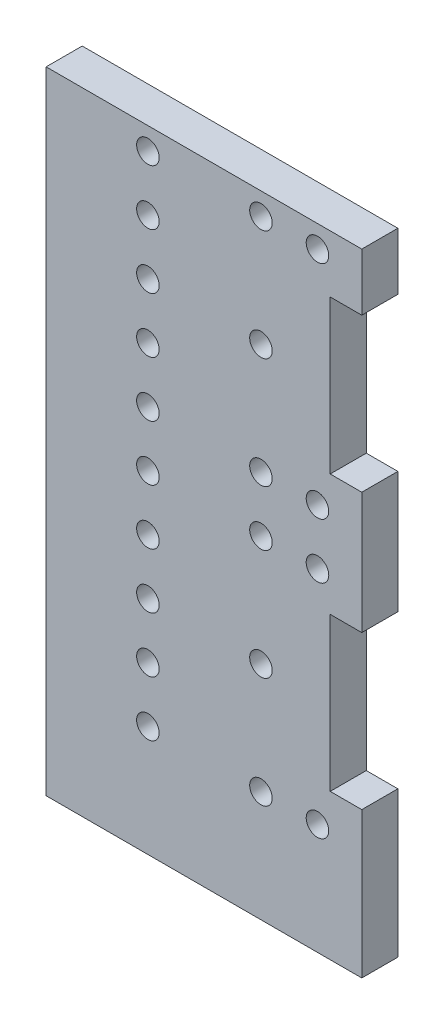
ISO-10303-21;
HEADER;
FILE_DESCRIPTION(('STEP AP214'),'2;1');
FILE_NAME('part.step','',(''),(''),'','','');
FILE_SCHEMA(('AUTOMOTIVE_DESIGN { 1 0 10303 214 1 1 1 1 }'));
ENDSEC;
DATA;
#1=APPLICATION_CONTEXT('core data for automotive mechanical design processes');
#2=APPLICATION_PROTOCOL_DEFINITION('international standard','automotive_design',2000,#1);
#3=PRODUCT_CONTEXT('',#1,'mechanical');
#4=PRODUCT('Part','Part','',(#3));
#5=PRODUCT_RELATED_PRODUCT_CATEGORY('part','',(#4));
#6=PRODUCT_DEFINITION_FORMATION('','',#4);
#7=PRODUCT_DEFINITION_CONTEXT('part definition',#1,'design');
#8=PRODUCT_DEFINITION('design','',#6,#7);
#9=PRODUCT_DEFINITION_SHAPE('','',#8);
#10=(LENGTH_UNIT() NAMED_UNIT(*) SI_UNIT(.MILLI.,.METRE.));
#11=(NAMED_UNIT(*) PLANE_ANGLE_UNIT() SI_UNIT($,.RADIAN.));
#12=(NAMED_UNIT(*) SI_UNIT($,.STERADIAN.) SOLID_ANGLE_UNIT());
#13=UNCERTAINTY_MEASURE_WITH_UNIT(LENGTH_MEASURE(1.E-05),#10,'distance_accuracy_value','');
#14=(GEOMETRIC_REPRESENTATION_CONTEXT(3) GLOBAL_UNCERTAINTY_ASSIGNED_CONTEXT((#13)) GLOBAL_UNIT_ASSIGNED_CONTEXT((#10,
#11,#12)) REPRESENTATION_CONTEXT('',''));
#15=CARTESIAN_POINT('',(0.,0.,0.));
#16=DIRECTION('',(0.,0.,1.));
#17=DIRECTION('',(1.,0.,0.));
#18=AXIS2_PLACEMENT_3D('',#15,#16,#17);
#19=CARTESIAN_POINT('',(7.,-7.532,1.6));
#20=DIRECTION('',(-1.,0.,0.));
#21=DIRECTION('',(0.,-1.,0.));
#22=AXIS2_PLACEMENT_3D('',#19,#20,#21);
#23=PLANE('',#22);
#24=DIRECTION('',(0.,1.,0.));
#25=VECTOR('',#24,1.);
#26=CARTESIAN_POINT('',(7.,-7.532,0.));
#27=LINE('',#26,#25);
#28=CARTESIAN_POINT('',(7.,-14.,0.));
#29=VERTEX_POINT('',#28);
#30=CARTESIAN_POINT('',(7.,-7.532,0.));
#31=VERTEX_POINT('',#30);
#32=EDGE_CURVE('E166',#29,#31,#27,.T.);
#33=ORIENTED_EDGE('',*,*,#32,.T.);
#34=DIRECTION('',(0.,0.,-1.));
#35=VECTOR('',#34,1.);
#36=CARTESIAN_POINT('',(7.,-7.532,1.6));
#37=LINE('',#36,#35);
#38=CARTESIAN_POINT('',(7.,-7.532,1.6));
#39=VERTEX_POINT('',#38);
#40=EDGE_CURVE('E11',#39,#31,#37,.T.);
#41=ORIENTED_EDGE('',*,*,#40,.F.);
#42=DIRECTION('',(0.,1.,0.));
#43=VECTOR('',#42,1.);
#44=CARTESIAN_POINT('',(7.,-7.532,1.6));
#45=LINE('',#44,#43);
#46=CARTESIAN_POINT('',(7.,-14.,1.6));
#47=VERTEX_POINT('',#46);
#48=EDGE_CURVE('E201',#47,#39,#45,.T.);
#49=ORIENTED_EDGE('',*,*,#48,.F.);
#50=DIRECTION('',(0.,0.,-1.));
#51=VECTOR('',#50,1.);
#52=CARTESIAN_POINT('',(7.,-14.,1.6));
#53=LINE('',#52,#51);
#54=EDGE_CURVE('E162',#47,#29,#53,.T.);
#55=ORIENTED_EDGE('',*,*,#54,.T.);
#56=EDGE_LOOP('',(#33,#41,#49,#55));
#57=FACE_BOUND('',#56,.T.);
#58=ADVANCED_FACE('F41',(#57),#23,.F.);
#59=CARTESIAN_POINT('',(5.6,-7.532,1.6));
#60=DIRECTION('',(0.,-1.,0.));
#61=DIRECTION('',(0.,0.,-1.));
#62=AXIS2_PLACEMENT_3D('',#59,#60,#61);
#63=PLANE('',#62);
#64=DIRECTION('',(-1.,0.,0.));
#65=VECTOR('',#64,1.);
#66=CARTESIAN_POINT('',(5.6,-7.532,0.));
#67=LINE('',#66,#65);
#68=CARTESIAN_POINT('',(5.6,-7.532,0.));
#69=VERTEX_POINT('',#68);
#70=EDGE_CURVE('E170',#31,#69,#67,.T.);
#71=ORIENTED_EDGE('',*,*,#70,.T.);
#72=DIRECTION('',(0.,0.,-1.));
#73=VECTOR('',#72,1.);
#74=CARTESIAN_POINT('',(5.6,-7.532,1.6));
#75=LINE('',#74,#73);
#76=CARTESIAN_POINT('',(5.6,-7.532,1.6));
#77=VERTEX_POINT('',#76);
#78=EDGE_CURVE('E50',#77,#69,#75,.T.);
#79=ORIENTED_EDGE('',*,*,#78,.F.);
#80=DIRECTION('',(-1.,0.,0.));
#81=VECTOR('',#80,1.);
#82=CARTESIAN_POINT('',(5.6,-7.532,1.6));
#83=LINE('',#82,#81);
#84=EDGE_CURVE('E113',#39,#77,#83,.T.);
#85=ORIENTED_EDGE('',*,*,#84,.F.);
#86=ORIENTED_EDGE('',*,*,#40,.T.);
#87=EDGE_LOOP('',(#71,#79,#85,#86));
#88=FACE_BOUND('',#87,.T.);
#89=ADVANCED_FACE('F296',(#88),#63,.F.);
#90=CARTESIAN_POINT('',(5.6,-0.732,1.6));
#91=DIRECTION('',(-1.,0.,0.));
#92=DIRECTION('',(0.,-1.,0.));
#93=AXIS2_PLACEMENT_3D('',#90,#91,#92);
#94=PLANE('',#93);
#95=DIRECTION('',(0.,1.,0.));
#96=VECTOR('',#95,1.);
#97=CARTESIAN_POINT('',(5.6,-0.732,0.));
#98=LINE('',#97,#96);
#99=CARTESIAN_POINT('',(5.6,-0.732,0.));
#100=VERTEX_POINT('',#99);
#101=EDGE_CURVE('E174',#69,#100,#98,.T.);
#102=ORIENTED_EDGE('',*,*,#101,.T.);
#103=DIRECTION('',(0.,0.,-1.));
#104=VECTOR('',#103,1.);
#105=CARTESIAN_POINT('',(5.6,-0.732,1.6));
#106=LINE('',#105,#104);
#107=CARTESIAN_POINT('',(5.6,-0.732,1.6));
#108=VERTEX_POINT('',#107);
#109=EDGE_CURVE('E228',#108,#100,#106,.T.);
#110=ORIENTED_EDGE('',*,*,#109,.F.);
#111=DIRECTION('',(0.,1.,0.));
#112=VECTOR('',#111,1.);
#113=CARTESIAN_POINT('',(5.6,-0.732,1.6));
#114=LINE('',#113,#112);
#115=EDGE_CURVE('E238',#77,#108,#114,.T.);
#116=ORIENTED_EDGE('',*,*,#115,.F.);
#117=ORIENTED_EDGE('',*,*,#78,.T.);
#118=EDGE_LOOP('',(#102,#110,#116,#117));
#119=FACE_BOUND('',#118,.T.);
#120=ADVANCED_FACE('F236',(#119),#94,.F.);
#121=CARTESIAN_POINT('',(7.,-0.732,1.6));
#122=DIRECTION('',(0.,1.,0.));
#123=DIRECTION('',(-1.,0.,0.));
#124=AXIS2_PLACEMENT_3D('',#121,#122,#123);
#125=PLANE('',#124);
#126=DIRECTION('',(1.,0.,0.));
#127=VECTOR('',#126,1.);
#128=CARTESIAN_POINT('',(7.,-0.732,0.));
#129=LINE('',#128,#127);
#130=CARTESIAN_POINT('',(7.,-0.732,0.));
#131=VERTEX_POINT('',#130);
#132=EDGE_CURVE('E177',#100,#131,#129,.T.);
#133=ORIENTED_EDGE('',*,*,#132,.T.);
#134=DIRECTION('',(0.,0.,-1.));
#135=VECTOR('',#134,1.);
#136=CARTESIAN_POINT('',(7.,-0.732,1.6));
#137=LINE('',#136,#135);
#138=CARTESIAN_POINT('',(7.,-0.732,1.6));
#139=VERTEX_POINT('',#138);
#140=EDGE_CURVE('E224',#139,#131,#137,.T.);
#141=ORIENTED_EDGE('',*,*,#140,.F.);
#142=DIRECTION('',(1.,0.,0.));
#143=VECTOR('',#142,1.);
#144=CARTESIAN_POINT('',(7.,-0.732,1.6));
#145=LINE('',#144,#143);
#146=EDGE_CURVE('E257',#108,#139,#145,.T.);
#147=ORIENTED_EDGE('',*,*,#146,.F.);
#148=ORIENTED_EDGE('',*,*,#109,.T.);
#149=EDGE_LOOP('',(#133,#141,#147,#148));
#150=FACE_BOUND('',#149,.T.);
#151=ADVANCED_FACE('F247',(#150),#125,.F.);
#152=CARTESIAN_POINT('',(7.,4.66,1.6));
#153=DIRECTION('',(-1.,0.,0.));
#154=DIRECTION('',(0.,-1.,0.));
#155=AXIS2_PLACEMENT_3D('',#152,#153,#154);
#156=PLANE('',#155);
#157=DIRECTION('',(0.,1.,0.));
#158=VECTOR('',#157,1.);
#159=CARTESIAN_POINT('',(7.,4.66,0.));
#160=LINE('',#159,#158);
#161=CARTESIAN_POINT('',(7.,4.66,0.));
#162=VERTEX_POINT('',#161);
#163=EDGE_CURVE('E180',#131,#162,#160,.T.);
#164=ORIENTED_EDGE('',*,*,#163,.T.);
#165=DIRECTION('',(0.,0.,-1.));
#166=VECTOR('',#165,1.);
#167=CARTESIAN_POINT('',(7.,4.66,1.6));
#168=LINE('',#167,#166);
#169=CARTESIAN_POINT('',(7.,4.66,1.6));
#170=VERTEX_POINT('',#169);
#171=EDGE_CURVE('E220',#170,#162,#168,.T.);
#172=ORIENTED_EDGE('',*,*,#171,.F.);
#173=DIRECTION('',(0.,1.,0.));
#174=VECTOR('',#173,1.);
#175=CARTESIAN_POINT('',(7.,4.66,1.6));
#176=LINE('',#175,#174);
#177=EDGE_CURVE('E253',#139,#170,#176,.T.);
#178=ORIENTED_EDGE('',*,*,#177,.F.);
#179=ORIENTED_EDGE('',*,*,#140,.T.);
#180=EDGE_LOOP('',(#164,#172,#178,#179));
#181=FACE_BOUND('',#180,.T.);
#182=ADVANCED_FACE('F251',(#181),#156,.F.);
#183=CARTESIAN_POINT('',(5.6,4.66,1.6));
#184=DIRECTION('',(0.,-1.,0.));
#185=DIRECTION('',(0.,0.,-1.));
#186=AXIS2_PLACEMENT_3D('',#183,#184,#185);
#187=PLANE('',#186);
#188=DIRECTION('',(-1.,0.,0.));
#189=VECTOR('',#188,1.);
#190=CARTESIAN_POINT('',(5.6,4.66,0.));
#191=LINE('',#190,#189);
#192=CARTESIAN_POINT('',(5.6,4.66,0.));
#193=VERTEX_POINT('',#192);
#194=EDGE_CURVE('E183',#162,#193,#191,.T.);
#195=ORIENTED_EDGE('',*,*,#194,.T.);
#196=DIRECTION('',(0.,0.,-1.));
#197=VECTOR('',#196,1.);
#198=CARTESIAN_POINT('',(5.6,4.66,1.6));
#199=LINE('',#198,#197);
#200=CARTESIAN_POINT('',(5.6,4.66,1.6));
#201=VERTEX_POINT('',#200);
#202=EDGE_CURVE('E216',#201,#193,#199,.T.);
#203=ORIENTED_EDGE('',*,*,#202,.F.);
#204=DIRECTION('',(-1.,0.,0.));
#205=VECTOR('',#204,1.);
#206=CARTESIAN_POINT('',(5.6,4.66,1.6));
#207=LINE('',#206,#205);
#208=EDGE_CURVE('E256',#170,#201,#207,.T.);
#209=ORIENTED_EDGE('',*,*,#208,.F.);
#210=ORIENTED_EDGE('',*,*,#171,.T.);
#211=EDGE_LOOP('',(#195,#203,#209,#210));
#212=FACE_BOUND('',#211,.T.);
#213=ADVANCED_FACE('F309',(#212),#187,.F.);
#214=CARTESIAN_POINT('',(5.6,11.46,1.6));
#215=DIRECTION('',(-1.,0.,0.));
#216=DIRECTION('',(0.,0.,1.));
#217=AXIS2_PLACEMENT_3D('',#214,#215,#216);
#218=PLANE('',#217);
#219=DIRECTION('',(0.,1.,0.));
#220=VECTOR('',#219,1.);
#221=CARTESIAN_POINT('',(5.6,11.46,0.));
#222=LINE('',#221,#220);
#223=CARTESIAN_POINT('',(5.6,11.46,0.));
#224=VERTEX_POINT('',#223);
#225=EDGE_CURVE('E186',#193,#224,#222,.T.);
#226=ORIENTED_EDGE('',*,*,#225,.T.);
#227=DIRECTION('',(0.,0.,-1.));
#228=VECTOR('',#227,1.);
#229=CARTESIAN_POINT('',(5.6,11.46,1.6));
#230=LINE('',#229,#228);
#231=CARTESIAN_POINT('',(5.6,11.46,1.6));
#232=VERTEX_POINT('',#231);
#233=EDGE_CURVE('E212',#232,#224,#230,.T.);
#234=ORIENTED_EDGE('',*,*,#233,.F.);
#235=DIRECTION('',(0.,1.,0.));
#236=VECTOR('',#235,1.);
#237=CARTESIAN_POINT('',(5.6,11.46,1.6));
#238=LINE('',#237,#236);
#239=EDGE_CURVE('E261',#201,#232,#238,.T.);
#240=ORIENTED_EDGE('',*,*,#239,.F.);
#241=ORIENTED_EDGE('',*,*,#202,.T.);
#242=EDGE_LOOP('',(#226,#234,#240,#241));
#243=FACE_BOUND('',#242,.T.);
#244=ADVANCED_FACE('F312',(#243),#218,.F.);
#245=CARTESIAN_POINT('',(7.,11.46,1.6));
#246=DIRECTION('',(0.,1.,0.));
#247=DIRECTION('',(0.,0.,1.));
#248=AXIS2_PLACEMENT_3D('',#245,#246,#247);
#249=PLANE('',#248);
#250=DIRECTION('',(1.,0.,0.));
#251=VECTOR('',#250,1.);
#252=CARTESIAN_POINT('',(7.,11.46,0.));
#253=LINE('',#252,#251);
#254=CARTESIAN_POINT('',(7.,11.46,0.));
#255=VERTEX_POINT('',#254);
#256=EDGE_CURVE('E189',#224,#255,#253,.T.);
#257=ORIENTED_EDGE('',*,*,#256,.T.);
#258=DIRECTION('',(0.,0.,-1.));
#259=VECTOR('',#258,1.);
#260=CARTESIAN_POINT('',(7.,11.46,1.6));
#261=LINE('',#260,#259);
#262=CARTESIAN_POINT('',(7.,11.46,1.6));
#263=VERTEX_POINT('',#262);
#264=EDGE_CURVE('E208',#263,#255,#261,.T.);
#265=ORIENTED_EDGE('',*,*,#264,.F.);
#266=DIRECTION('',(1.,0.,0.));
#267=VECTOR('',#266,1.);
#268=CARTESIAN_POINT('',(7.,11.46,1.6));
#269=LINE('',#268,#267);
#270=EDGE_CURVE('E268',#232,#263,#269,.T.);
#271=ORIENTED_EDGE('',*,*,#270,.F.);
#272=ORIENTED_EDGE('',*,*,#233,.T.);
#273=EDGE_LOOP('',(#257,#265,#271,#272));
#274=FACE_BOUND('',#273,.T.);
#275=ADVANCED_FACE('F276',(#274),#249,.F.);
#276=CARTESIAN_POINT('',(7.,14.,1.6));
#277=DIRECTION('',(-1.,0.,0.));
#278=DIRECTION('',(0.,0.,1.));
#279=AXIS2_PLACEMENT_3D('',#276,#277,#278);
#280=PLANE('',#279);
#281=DIRECTION('',(0.,1.,0.));
#282=VECTOR('',#281,1.);
#283=CARTESIAN_POINT('',(7.,14.,0.));
#284=LINE('',#283,#282);
#285=CARTESIAN_POINT('',(7.,14.,0.));
#286=VERTEX_POINT('',#285);
#287=EDGE_CURVE('E192',#255,#286,#284,.T.);
#288=ORIENTED_EDGE('',*,*,#287,.T.);
#289=DIRECTION('',(0.,0.,-1.));
#290=VECTOR('',#289,1.);
#291=CARTESIAN_POINT('',(7.,14.,1.6));
#292=LINE('',#291,#290);
#293=CARTESIAN_POINT('',(7.,14.,1.6));
#294=VERTEX_POINT('',#293);
#295=EDGE_CURVE('E155',#294,#286,#292,.T.);
#296=ORIENTED_EDGE('',*,*,#295,.F.);
#297=DIRECTION('',(0.,1.,0.));
#298=VECTOR('',#297,1.);
#299=CARTESIAN_POINT('',(7.,14.,1.6));
#300=LINE('',#299,#298);
#301=EDGE_CURVE('E144',#263,#294,#300,.T.);
#302=ORIENTED_EDGE('',*,*,#301,.F.);
#303=ORIENTED_EDGE('',*,*,#264,.T.);
#304=EDGE_LOOP('',(#288,#296,#302,#303));
#305=FACE_BOUND('',#304,.T.);
#306=ADVANCED_FACE('F280',(#305),#280,.F.);
#307=CARTESIAN_POINT('',(-7.,14.,1.6));
#308=DIRECTION('',(0.,-1.,0.));
#309=DIRECTION('',(0.,0.,-1.));
#310=AXIS2_PLACEMENT_3D('',#307,#308,#309);
#311=PLANE('',#310);
#312=DIRECTION('',(-1.,0.,0.));
#313=VECTOR('',#312,1.);
#314=CARTESIAN_POINT('',(-7.,14.,0.));
#315=LINE('',#314,#313);
#316=CARTESIAN_POINT('',(-7.,14.,0.));
#317=VERTEX_POINT('',#316);
#318=EDGE_CURVE('E153',#286,#317,#315,.T.);
#319=ORIENTED_EDGE('',*,*,#318,.T.);
#320=DIRECTION('',(0.,0.,-1.));
#321=VECTOR('',#320,1.);
#322=CARTESIAN_POINT('',(-7.,14.,1.6));
#323=LINE('',#322,#321);
#324=CARTESIAN_POINT('',(-7.,14.,1.6));
#325=VERTEX_POINT('',#324);
#326=EDGE_CURVE('E150',#325,#317,#323,.T.);
#327=ORIENTED_EDGE('',*,*,#326,.F.);
#328=DIRECTION('',(-1.,0.,0.));
#329=VECTOR('',#328,1.);
#330=CARTESIAN_POINT('',(-7.,14.,1.6));
#331=LINE('',#330,#329);
#332=EDGE_CURVE('E138',#294,#325,#331,.T.);
#333=ORIENTED_EDGE('',*,*,#332,.F.);
#334=ORIENTED_EDGE('',*,*,#295,.T.);
#335=EDGE_LOOP('',(#319,#327,#333,#334));
#336=FACE_BOUND('',#335,.T.);
#337=ADVANCED_FACE('F151',(#336),#311,.F.);
#338=CARTESIAN_POINT('',(-7.,14.,1.6));
#339=DIRECTION('',(1.,0.,0.));
#340=DIRECTION('',(0.,1.,0.));
#341=AXIS2_PLACEMENT_3D('',#338,#339,#340);
#342=PLANE('',#341);
#343=DIRECTION('',(0.,-1.,0.));
#344=VECTOR('',#343,1.);
#345=CARTESIAN_POINT('',(-7.,14.,0.));
#346=LINE('',#345,#344);
#347=CARTESIAN_POINT('',(-7.,-14.,0.));
#348=VERTEX_POINT('',#347);
#349=EDGE_CURVE('E99',#317,#348,#346,.T.);
#350=ORIENTED_EDGE('',*,*,#349,.T.);
#351=DIRECTION('',(0.,0.,-1.));
#352=VECTOR('',#351,1.);
#353=CARTESIAN_POINT('',(-7.,-14.,1.6));
#354=LINE('',#353,#352);
#355=CARTESIAN_POINT('',(-7.,-14.,1.6));
#356=VERTEX_POINT('',#355);
#357=EDGE_CURVE('E156',#356,#348,#354,.T.);
#358=ORIENTED_EDGE('',*,*,#357,.F.);
#359=DIRECTION('',(0.,-1.,0.));
#360=VECTOR('',#359,1.);
#361=CARTESIAN_POINT('',(-7.,14.,1.6));
#362=LINE('',#361,#360);
#363=EDGE_CURVE('E142',#325,#356,#362,.T.);
#364=ORIENTED_EDGE('',*,*,#363,.F.);
#365=ORIENTED_EDGE('',*,*,#326,.T.);
#366=EDGE_LOOP('',(#350,#358,#364,#365));
#367=FACE_BOUND('',#366,.T.);
#368=ADVANCED_FACE('F158',(#367),#342,.F.);
#369=CARTESIAN_POINT('',(-7.,-14.,1.6));
#370=DIRECTION('',(0.,1.,0.));
#371=DIRECTION('',(0.,0.,1.));
#372=AXIS2_PLACEMENT_3D('',#369,#370,#371);
#373=PLANE('',#372);
#374=DIRECTION('',(1.,0.,0.));
#375=VECTOR('',#374,1.);
#376=CARTESIAN_POINT('',(-7.,-14.,0.));
#377=LINE('',#376,#375);
#378=EDGE_CURVE('E105',#348,#29,#377,.T.);
#379=ORIENTED_EDGE('',*,*,#378,.T.);
#380=ORIENTED_EDGE('',*,*,#54,.F.);
#381=DIRECTION('',(1.,0.,0.));
#382=VECTOR('',#381,1.);
#383=CARTESIAN_POINT('',(-7.,-14.,1.6));
#384=LINE('',#383,#382);
#385=EDGE_CURVE('E58',#356,#47,#384,.T.);
#386=ORIENTED_EDGE('',*,*,#385,.F.);
#387=ORIENTED_EDGE('',*,*,#357,.T.);
#388=EDGE_LOOP('',(#379,#380,#386,#387));
#389=FACE_BOUND('',#388,.T.);
#390=ADVANCED_FACE('F284',(#389),#373,.F.);
#391=CARTESIAN_POINT('',(0.,0.,1.6));
#392=DIRECTION('',(0.,0.,1.));
#393=DIRECTION('',(1.,0.,0.));
#394=AXIS2_PLACEMENT_3D('',#391,#392,#393);
#395=PLANE('',#394);
#396=CARTESIAN_POINT('',(2.52764467830535,0.738130306615863,1.6));
#397=DIRECTION('',(0.,0.,1.));
#398=DIRECTION('',(1.,0.,0.));
#399=AXIS2_PLACEMENT_3D('',#396,#397,#398);
#400=CIRCLE('',#399,0.5);
#401=CARTESIAN_POINT('',(3.02764467830535,0.738130306615863,1.6));
#402=VERTEX_POINT('',#401);
#403=EDGE_CURVE('E560',#402,#402,#400,.T.);
#404=ORIENTED_EDGE('',*,*,#403,.F.);
#405=EDGE_LOOP('',(#404));
#406=FACE_BOUND('',#405,.T.);
#407=CARTESIAN_POINT('',(-2.48693595889968,-4.17195256340917,1.6));
#408=DIRECTION('',(0.,0.,1.));
#409=DIRECTION('',(1.,0.,0.));
#410=AXIS2_PLACEMENT_3D('',#407,#408,#409);
#411=CIRCLE('',#410,0.5);
#412=CARTESIAN_POINT('',(-1.98693595889968,-4.17195256340917,1.6));
#413=VERTEX_POINT('',#412);
#414=EDGE_CURVE('E566',#413,#413,#411,.T.);
#415=ORIENTED_EDGE('',*,*,#414,.F.);
#416=EDGE_LOOP('',(#415));
#417=FACE_BOUND('',#416,.T.);
#418=CARTESIAN_POINT('',(2.52764467830535,8.10325461165342,1.6));
#419=DIRECTION('',(0.,0.,1.));
#420=DIRECTION('',(1.,0.,0.));
#421=AXIS2_PLACEMENT_3D('',#418,#419,#420);
#422=CIRCLE('',#421,0.5);
#423=CARTESIAN_POINT('',(3.02764467830535,8.10325461165342,1.6));
#424=VERTEX_POINT('',#423);
#425=EDGE_CURVE('E586',#424,#424,#422,.T.);
#426=ORIENTED_EDGE('',*,*,#425,.F.);
#427=EDGE_LOOP('',(#426));
#428=FACE_BOUND('',#427,.T.);
#429=CARTESIAN_POINT('',(2.52764467830535,-4.17195256340917,1.6));
#430=DIRECTION('',(0.,0.,1.));
#431=DIRECTION('',(1.,0.,0.));
#432=AXIS2_PLACEMENT_3D('',#429,#430,#431);
#433=CIRCLE('',#432,0.5);
#434=CARTESIAN_POINT('',(3.02764467830535,-4.17195256340917,1.6));
#435=VERTEX_POINT('',#434);
#436=EDGE_CURVE('E578',#435,#435,#433,.T.);
#437=ORIENTED_EDGE('',*,*,#436,.F.);
#438=EDGE_LOOP('',(#437));
#439=FACE_BOUND('',#438,.T.);
#440=CARTESIAN_POINT('',(2.52764467830535,13.0133374816784,1.6));
#441=DIRECTION('',(0.,0.,1.));
#442=DIRECTION('',(1.,0.,0.));
#443=AXIS2_PLACEMENT_3D('',#440,#441,#442);
#444=CIRCLE('',#443,0.5);
#445=CARTESIAN_POINT('',(3.02764467830535,13.0133374816784,1.6));
#446=VERTEX_POINT('',#445);
#447=EDGE_CURVE('E685',#446,#446,#444,.T.);
#448=ORIENTED_EDGE('',*,*,#447,.F.);
#449=EDGE_LOOP('',(#448));
#450=FACE_BOUND('',#449,.T.);
#451=CARTESIAN_POINT('',(5.03493499690787,0.738130306615863,1.6));
#452=DIRECTION('',(0.,0.,1.));
#453=DIRECTION('',(1.,0.,0.));
#454=AXIS2_PLACEMENT_3D('',#451,#452,#453);
#455=CIRCLE('',#454,0.500000000000001);
#456=CARTESIAN_POINT('',(5.53493499690787,0.738130306615863,1.6));
#457=VERTEX_POINT('',#456);
#458=EDGE_CURVE('E694',#457,#457,#455,.T.);
#459=ORIENTED_EDGE('',*,*,#458,.F.);
#460=EDGE_LOOP('',(#459));
#461=FACE_BOUND('',#460,.T.);
#462=CARTESIAN_POINT('',(5.03493499690787,3.19317174162838,1.6));
#463=DIRECTION('',(0.,0.,1.));
#464=DIRECTION('',(1.,0.,0.));
#465=AXIS2_PLACEMENT_3D('',#462,#463,#464);
#466=CIRCLE('',#465,0.500000000000001);
#467=CARTESIAN_POINT('',(5.53493499690787,3.19317174162838,1.6));
#468=VERTEX_POINT('',#467);
#469=EDGE_CURVE('E673',#468,#468,#466,.T.);
#470=ORIENTED_EDGE('',*,*,#469,.F.);
#471=EDGE_LOOP('',(#470));
#472=FACE_BOUND('',#471,.T.);
#473=CARTESIAN_POINT('',(2.52764467830535,3.19317174162838,1.6));
#474=DIRECTION('',(0.,0.,1.));
#475=DIRECTION('',(1.,0.,0.));
#476=AXIS2_PLACEMENT_3D('',#473,#474,#475);
#477=CIRCLE('',#476,0.5);
#478=CARTESIAN_POINT('',(3.02764467830535,3.19317174162838,1.6));
#479=VERTEX_POINT('',#478);
#480=EDGE_CURVE('E569',#479,#479,#477,.T.);
#481=ORIENTED_EDGE('',*,*,#480,.F.);
#482=EDGE_LOOP('',(#481));
#483=FACE_BOUND('',#482,.T.);
#484=CARTESIAN_POINT('',(-2.48693595889968,-9.08203543343421,1.6));
#485=DIRECTION('',(0.,0.,1.));
#486=DIRECTION('',(1.,0.,0.));
#487=AXIS2_PLACEMENT_3D('',#484,#485,#486);
#488=CIRCLE('',#487,0.5);
#489=CARTESIAN_POINT('',(-1.98693595889968,-9.08203543343421,1.6));
#490=VERTEX_POINT('',#489);
#491=EDGE_CURVE('E577',#490,#490,#488,.T.);
#492=ORIENTED_EDGE('',*,*,#491,.F.);
#493=EDGE_LOOP('',(#492));
#494=FACE_BOUND('',#493,.T.);
#495=CARTESIAN_POINT('',(-2.48693595889968,-6.62699399842169,1.6));
#496=DIRECTION('',(0.,0.,1.));
#497=DIRECTION('',(1.,0.,0.));
#498=AXIS2_PLACEMENT_3D('',#495,#496,#497);
#499=CIRCLE('',#498,0.5);
#500=CARTESIAN_POINT('',(-1.98693595889968,-6.62699399842169,1.6));
#501=VERTEX_POINT('',#500);
#502=EDGE_CURVE('E644',#501,#501,#499,.T.);
#503=ORIENTED_EDGE('',*,*,#502,.F.);
#504=EDGE_LOOP('',(#503));
#505=FACE_BOUND('',#504,.T.);
#506=CARTESIAN_POINT('',(-2.48693595889968,-1.71691112839665,1.6));
#507=DIRECTION('',(0.,0.,1.));
#508=DIRECTION('',(1.,0.,0.));
#509=AXIS2_PLACEMENT_3D('',#506,#507,#508);
#510=CIRCLE('',#509,0.5);
#511=CARTESIAN_POINT('',(-1.98693595889968,-1.71691112839665,1.6));
#512=VERTEX_POINT('',#511);
#513=EDGE_CURVE('E636',#512,#512,#510,.T.);
#514=ORIENTED_EDGE('',*,*,#513,.F.);
#515=EDGE_LOOP('',(#514));
#516=FACE_BOUND('',#515,.T.);
#517=CARTESIAN_POINT('',(-2.48693595889968,0.738130306615863,1.6));
#518=DIRECTION('',(0.,0.,1.));
#519=DIRECTION('',(1.,0.,0.));
#520=AXIS2_PLACEMENT_3D('',#517,#518,#519);
#521=CIRCLE('',#520,0.5);
#522=CARTESIAN_POINT('',(-1.98693595889968,0.738130306615863,1.6));
#523=VERTEX_POINT('',#522);
#524=EDGE_CURVE('E628',#523,#523,#521,.T.);
#525=ORIENTED_EDGE('',*,*,#524,.F.);
#526=EDGE_LOOP('',(#525));
#527=FACE_BOUND('',#526,.T.);
#528=CARTESIAN_POINT('',(-2.48693595889968,3.19317174162838,1.6));
#529=DIRECTION('',(0.,0.,1.));
#530=DIRECTION('',(1.,0.,0.));
#531=AXIS2_PLACEMENT_3D('',#528,#529,#530);
#532=CIRCLE('',#531,0.5);
#533=CARTESIAN_POINT('',(-1.98693595889968,3.19317174162838,1.6));
#534=VERTEX_POINT('',#533);
#535=EDGE_CURVE('E620',#534,#534,#532,.T.);
#536=ORIENTED_EDGE('',*,*,#535,.F.);
#537=EDGE_LOOP('',(#536));
#538=FACE_BOUND('',#537,.T.);
#539=CARTESIAN_POINT('',(-2.48693595889968,5.6482131766409,1.6));
#540=DIRECTION('',(0.,0.,1.));
#541=DIRECTION('',(1.,0.,0.));
#542=AXIS2_PLACEMENT_3D('',#539,#540,#541);
#543=CIRCLE('',#542,0.5);
#544=CARTESIAN_POINT('',(-1.98693595889968,5.6482131766409,1.6));
#545=VERTEX_POINT('',#544);
#546=EDGE_CURVE('E612',#545,#545,#543,.T.);
#547=ORIENTED_EDGE('',*,*,#546,.F.);
#548=EDGE_LOOP('',(#547));
#549=FACE_BOUND('',#548,.T.);
#550=CARTESIAN_POINT('',(-2.48693595889968,8.10325461165342,1.6));
#551=DIRECTION('',(0.,0.,1.));
#552=DIRECTION('',(1.,0.,0.));
#553=AXIS2_PLACEMENT_3D('',#550,#551,#552);
#554=CIRCLE('',#553,0.5);
#555=CARTESIAN_POINT('',(-1.98693595889968,8.10325461165342,1.6));
#556=VERTEX_POINT('',#555);
#557=EDGE_CURVE('E604',#556,#556,#554,.T.);
#558=ORIENTED_EDGE('',*,*,#557,.F.);
#559=EDGE_LOOP('',(#558));
#560=FACE_BOUND('',#559,.T.);
#561=CARTESIAN_POINT('',(-2.48693595889968,10.5582960466659,1.6));
#562=DIRECTION('',(0.,0.,1.));
#563=DIRECTION('',(1.,0.,0.));
#564=AXIS2_PLACEMENT_3D('',#561,#562,#563);
#565=CIRCLE('',#564,0.5);
#566=CARTESIAN_POINT('',(-1.98693595889968,10.5582960466659,1.6));
#567=VERTEX_POINT('',#566);
#568=EDGE_CURVE('E596',#567,#567,#565,.T.);
#569=ORIENTED_EDGE('',*,*,#568,.F.);
#570=EDGE_LOOP('',(#569));
#571=FACE_BOUND('',#570,.T.);
#572=CARTESIAN_POINT('',(5.03493499690787,13.0133374816784,1.6));
#573=DIRECTION('',(0.,0.,1.));
#574=DIRECTION('',(1.,0.,0.));
#575=AXIS2_PLACEMENT_3D('',#572,#573,#574);
#576=CIRCLE('',#575,0.500000000000001);
#577=CARTESIAN_POINT('',(5.53493499690787,13.0133374816784,1.6));
#578=VERTEX_POINT('',#577);
#579=EDGE_CURVE('E717',#578,#578,#576,.T.);
#580=ORIENTED_EDGE('',*,*,#579,.F.);
#581=EDGE_LOOP('',(#580));
#582=FACE_BOUND('',#581,.T.);
#583=CARTESIAN_POINT('',(5.03493499690787,-9.08203543343421,1.6));
#584=DIRECTION('',(0.,0.,1.));
#585=DIRECTION('',(1.,0.,0.));
#586=AXIS2_PLACEMENT_3D('',#583,#584,#585);
#587=CIRCLE('',#586,0.500000000000001);
#588=CARTESIAN_POINT('',(5.53493499690787,-9.08203543343421,1.6));
#589=VERTEX_POINT('',#588);
#590=EDGE_CURVE('E709',#589,#589,#587,.T.);
#591=ORIENTED_EDGE('',*,*,#590,.F.);
#592=EDGE_LOOP('',(#591));
#593=FACE_BOUND('',#592,.T.);
#594=CARTESIAN_POINT('',(2.52764467830535,-9.08203543343421,1.6));
#595=DIRECTION('',(0.,0.,1.));
#596=DIRECTION('',(1.,0.,0.));
#597=AXIS2_PLACEMENT_3D('',#594,#595,#596);
#598=CIRCLE('',#597,0.5);
#599=CARTESIAN_POINT('',(3.02764467830535,-9.08203543343421,1.6));
#600=VERTEX_POINT('',#599);
#601=EDGE_CURVE('E701',#600,#600,#598,.T.);
#602=ORIENTED_EDGE('',*,*,#601,.F.);
#603=EDGE_LOOP('',(#602));
#604=FACE_BOUND('',#603,.T.);
#605=CARTESIAN_POINT('',(-2.48693595889968,13.0133374816784,1.6));
#606=DIRECTION('',(0.,0.,1.));
#607=DIRECTION('',(1.,0.,0.));
#608=AXIS2_PLACEMENT_3D('',#605,#606,#607);
#609=CIRCLE('',#608,0.5);
#610=CARTESIAN_POINT('',(-1.98693595889968,13.0133374816784,1.6));
#611=VERTEX_POINT('',#610);
#612=EDGE_CURVE('E595',#611,#611,#609,.T.);
#613=ORIENTED_EDGE('',*,*,#612,.F.);
#614=EDGE_LOOP('',(#613));
#615=FACE_BOUND('',#614,.T.);
#616=ORIENTED_EDGE('',*,*,#48,.T.);
#617=ORIENTED_EDGE('',*,*,#84,.T.);
#618=ORIENTED_EDGE('',*,*,#115,.T.);
#619=ORIENTED_EDGE('',*,*,#146,.T.);
#620=ORIENTED_EDGE('',*,*,#177,.T.);
#621=ORIENTED_EDGE('',*,*,#208,.T.);
#622=ORIENTED_EDGE('',*,*,#239,.T.);
#623=ORIENTED_EDGE('',*,*,#270,.T.);
#624=ORIENTED_EDGE('',*,*,#301,.T.);
#625=ORIENTED_EDGE('',*,*,#332,.T.);
#626=ORIENTED_EDGE('',*,*,#363,.T.);
#627=ORIENTED_EDGE('',*,*,#385,.T.);
#628=EDGE_LOOP('',(#616,#617,#618,#619,#620,#621,#622,#623,#624,#625,#626,#627));
#629=FACE_BOUND('',#628,.T.);
#630=ADVANCED_FACE('F140',(#406,#417,#428,#439,#450,#461,#472,#483,#494,#505,#516,#527,#538,
#549,#560,#571,#582,#593,#604,#615,#629),#395,.T.);
#631=CARTESIAN_POINT('',(0.,0.,0.));
#632=DIRECTION('',(0.,0.,1.));
#633=DIRECTION('',(1.,0.,0.));
#634=AXIS2_PLACEMENT_3D('',#631,#632,#633);
#635=PLANE('',#634);
#636=CARTESIAN_POINT('',(2.52764467830535,0.738130306615863,0.));
#637=DIRECTION('',(0.,0.,1.));
#638=DIRECTION('',(1.,0.,0.));
#639=AXIS2_PLACEMENT_3D('',#636,#637,#638);
#640=CIRCLE('',#639,0.5);
#641=CARTESIAN_POINT('',(3.02764467830535,0.738130306615863,0.));
#642=VERTEX_POINT('',#641);
#643=EDGE_CURVE('E557',#642,#642,#640,.T.);
#644=ORIENTED_EDGE('',*,*,#643,.T.);
#645=EDGE_LOOP('',(#644));
#646=FACE_BOUND('',#645,.T.);
#647=CARTESIAN_POINT('',(-2.48693595889968,-4.17195256340917,0.));
#648=DIRECTION('',(0.,0.,1.));
#649=DIRECTION('',(1.,0.,0.));
#650=AXIS2_PLACEMENT_3D('',#647,#648,#649);
#651=CIRCLE('',#650,0.5);
#652=CARTESIAN_POINT('',(-1.98693595889968,-4.17195256340917,0.));
#653=VERTEX_POINT('',#652);
#654=EDGE_CURVE('E590',#653,#653,#651,.T.);
#655=ORIENTED_EDGE('',*,*,#654,.T.);
#656=EDGE_LOOP('',(#655));
#657=FACE_BOUND('',#656,.T.);
#658=CARTESIAN_POINT('',(2.52764467830535,8.10325461165342,0.));
#659=DIRECTION('',(0.,0.,1.));
#660=DIRECTION('',(1.,0.,0.));
#661=AXIS2_PLACEMENT_3D('',#658,#659,#660);
#662=CIRCLE('',#661,0.5);
#663=CARTESIAN_POINT('',(3.02764467830535,8.10325461165342,0.));
#664=VERTEX_POINT('',#663);
#665=EDGE_CURVE('E582',#664,#664,#662,.T.);
#666=ORIENTED_EDGE('',*,*,#665,.T.);
#667=EDGE_LOOP('',(#666));
#668=FACE_BOUND('',#667,.T.);
#669=CARTESIAN_POINT('',(2.52764467830535,-4.17195256340917,0.));
#670=DIRECTION('',(0.,0.,1.));
#671=DIRECTION('',(1.,0.,0.));
#672=AXIS2_PLACEMENT_3D('',#669,#670,#671);
#673=CIRCLE('',#672,0.5);
#674=CARTESIAN_POINT('',(3.02764467830535,-4.17195256340917,0.));
#675=VERTEX_POINT('',#674);
#676=EDGE_CURVE('E573',#675,#675,#673,.T.);
#677=ORIENTED_EDGE('',*,*,#676,.T.);
#678=EDGE_LOOP('',(#677));
#679=FACE_BOUND('',#678,.T.);
#680=CARTESIAN_POINT('',(2.52764467830535,13.0133374816784,0.));
#681=DIRECTION('',(0.,0.,1.));
#682=DIRECTION('',(1.,0.,0.));
#683=AXIS2_PLACEMENT_3D('',#680,#681,#682);
#684=CIRCLE('',#683,0.5);
#685=CARTESIAN_POINT('',(3.02764467830535,13.0133374816784,0.));
#686=VERTEX_POINT('',#685);
#687=EDGE_CURVE('E689',#686,#686,#684,.T.);
#688=ORIENTED_EDGE('',*,*,#687,.T.);
#689=EDGE_LOOP('',(#688));
#690=FACE_BOUND('',#689,.T.);
#691=CARTESIAN_POINT('',(5.03493499690787,0.738130306615863,0.));
#692=DIRECTION('',(0.,0.,1.));
#693=DIRECTION('',(1.,0.,0.));
#694=AXIS2_PLACEMENT_3D('',#691,#692,#693);
#695=CIRCLE('',#694,0.500000000000001);
#696=CARTESIAN_POINT('',(5.53493499690787,0.738130306615863,0.));
#697=VERTEX_POINT('',#696);
#698=EDGE_CURVE('E678',#697,#697,#695,.T.);
#699=ORIENTED_EDGE('',*,*,#698,.T.);
#700=EDGE_LOOP('',(#699));
#701=FACE_BOUND('',#700,.T.);
#702=CARTESIAN_POINT('',(5.03493499690787,3.19317174162838,0.));
#703=DIRECTION('',(0.,0.,1.));
#704=DIRECTION('',(1.,0.,0.));
#705=AXIS2_PLACEMENT_3D('',#702,#703,#704);
#706=CIRCLE('',#705,0.500000000000001);
#707=CARTESIAN_POINT('',(5.53493499690787,3.19317174162838,0.));
#708=VERTEX_POINT('',#707);
#709=EDGE_CURVE('E677',#708,#708,#706,.T.);
#710=ORIENTED_EDGE('',*,*,#709,.T.);
#711=EDGE_LOOP('',(#710));
#712=FACE_BOUND('',#711,.T.);
#713=CARTESIAN_POINT('',(2.52764467830535,3.19317174162838,0.));
#714=DIRECTION('',(0.,0.,1.));
#715=DIRECTION('',(1.,0.,0.));
#716=AXIS2_PLACEMENT_3D('',#713,#714,#715);
#717=CIRCLE('',#716,0.5);
#718=CARTESIAN_POINT('',(3.02764467830535,3.19317174162838,0.));
#719=VERTEX_POINT('',#718);
#720=EDGE_CURVE('E562',#719,#719,#717,.T.);
#721=ORIENTED_EDGE('',*,*,#720,.T.);
#722=EDGE_LOOP('',(#721));
#723=FACE_BOUND('',#722,.T.);
#724=CARTESIAN_POINT('',(-2.48693595889968,-9.08203543343421,0.));
#725=DIRECTION('',(0.,0.,1.));
#726=DIRECTION('',(1.,0.,0.));
#727=AXIS2_PLACEMENT_3D('',#724,#725,#726);
#728=CIRCLE('',#727,0.5);
#729=CARTESIAN_POINT('',(-1.98693595889968,-9.08203543343421,0.));
#730=VERTEX_POINT('',#729);
#731=EDGE_CURVE('E648',#730,#730,#728,.T.);
#732=ORIENTED_EDGE('',*,*,#731,.T.);
#733=EDGE_LOOP('',(#732));
#734=FACE_BOUND('',#733,.T.);
#735=CARTESIAN_POINT('',(-2.48693595889968,-6.62699399842169,0.));
#736=DIRECTION('',(0.,0.,1.));
#737=DIRECTION('',(1.,0.,0.));
#738=AXIS2_PLACEMENT_3D('',#735,#736,#737);
#739=CIRCLE('',#738,0.5);
#740=CARTESIAN_POINT('',(-1.98693595889968,-6.62699399842169,0.));
#741=VERTEX_POINT('',#740);
#742=EDGE_CURVE('E640',#741,#741,#739,.T.);
#743=ORIENTED_EDGE('',*,*,#742,.T.);
#744=EDGE_LOOP('',(#743));
#745=FACE_BOUND('',#744,.T.);
#746=CARTESIAN_POINT('',(-2.48693595889968,-1.71691112839665,0.));
#747=DIRECTION('',(0.,0.,1.));
#748=DIRECTION('',(1.,0.,0.));
#749=AXIS2_PLACEMENT_3D('',#746,#747,#748);
#750=CIRCLE('',#749,0.5);
#751=CARTESIAN_POINT('',(-1.98693595889968,-1.71691112839665,0.));
#752=VERTEX_POINT('',#751);
#753=EDGE_CURVE('E632',#752,#752,#750,.T.);
#754=ORIENTED_EDGE('',*,*,#753,.T.);
#755=EDGE_LOOP('',(#754));
#756=FACE_BOUND('',#755,.T.);
#757=CARTESIAN_POINT('',(-2.48693595889968,0.738130306615863,0.));
#758=DIRECTION('',(0.,0.,1.));
#759=DIRECTION('',(1.,0.,0.));
#760=AXIS2_PLACEMENT_3D('',#757,#758,#759);
#761=CIRCLE('',#760,0.5);
#762=CARTESIAN_POINT('',(-1.98693595889968,0.738130306615863,0.));
#763=VERTEX_POINT('',#762);
#764=EDGE_CURVE('E624',#763,#763,#761,.T.);
#765=ORIENTED_EDGE('',*,*,#764,.T.);
#766=EDGE_LOOP('',(#765));
#767=FACE_BOUND('',#766,.T.);
#768=CARTESIAN_POINT('',(-2.48693595889968,3.19317174162838,0.));
#769=DIRECTION('',(0.,0.,1.));
#770=DIRECTION('',(1.,0.,0.));
#771=AXIS2_PLACEMENT_3D('',#768,#769,#770);
#772=CIRCLE('',#771,0.5);
#773=CARTESIAN_POINT('',(-1.98693595889968,3.19317174162838,0.));
#774=VERTEX_POINT('',#773);
#775=EDGE_CURVE('E616',#774,#774,#772,.T.);
#776=ORIENTED_EDGE('',*,*,#775,.T.);
#777=EDGE_LOOP('',(#776));
#778=FACE_BOUND('',#777,.T.);
#779=CARTESIAN_POINT('',(-2.48693595889968,5.6482131766409,0.));
#780=DIRECTION('',(0.,0.,1.));
#781=DIRECTION('',(1.,0.,0.));
#782=AXIS2_PLACEMENT_3D('',#779,#780,#781);
#783=CIRCLE('',#782,0.5);
#784=CARTESIAN_POINT('',(-1.98693595889968,5.6482131766409,0.));
#785=VERTEX_POINT('',#784);
#786=EDGE_CURVE('E608',#785,#785,#783,.T.);
#787=ORIENTED_EDGE('',*,*,#786,.T.);
#788=EDGE_LOOP('',(#787));
#789=FACE_BOUND('',#788,.T.);
#790=CARTESIAN_POINT('',(-2.48693595889968,8.10325461165342,0.));
#791=DIRECTION('',(0.,0.,1.));
#792=DIRECTION('',(1.,0.,0.));
#793=AXIS2_PLACEMENT_3D('',#790,#791,#792);
#794=CIRCLE('',#793,0.5);
#795=CARTESIAN_POINT('',(-1.98693595889968,8.10325461165342,0.));
#796=VERTEX_POINT('',#795);
#797=EDGE_CURVE('E600',#796,#796,#794,.T.);
#798=ORIENTED_EDGE('',*,*,#797,.T.);
#799=EDGE_LOOP('',(#798));
#800=FACE_BOUND('',#799,.T.);
#801=CARTESIAN_POINT('',(-2.48693595889968,10.5582960466659,0.));
#802=DIRECTION('',(0.,0.,1.));
#803=DIRECTION('',(1.,0.,0.));
#804=AXIS2_PLACEMENT_3D('',#801,#802,#803);
#805=CIRCLE('',#804,0.5);
#806=CARTESIAN_POINT('',(-1.98693595889968,10.5582960466659,0.));
#807=VERTEX_POINT('',#806);
#808=EDGE_CURVE('E591',#807,#807,#805,.T.);
#809=ORIENTED_EDGE('',*,*,#808,.T.);
#810=EDGE_LOOP('',(#809));
#811=FACE_BOUND('',#810,.T.);
#812=CARTESIAN_POINT('',(5.03493499690787,13.0133374816784,0.));
#813=DIRECTION('',(0.,0.,1.));
#814=DIRECTION('',(1.,0.,0.));
#815=AXIS2_PLACEMENT_3D('',#812,#813,#814);
#816=CIRCLE('',#815,0.500000000000001);
#817=CARTESIAN_POINT('',(5.53493499690787,13.0133374816784,0.));
#818=VERTEX_POINT('',#817);
#819=EDGE_CURVE('E690',#818,#818,#816,.T.);
#820=ORIENTED_EDGE('',*,*,#819,.T.);
#821=EDGE_LOOP('',(#820));
#822=FACE_BOUND('',#821,.T.);
#823=CARTESIAN_POINT('',(5.03493499690787,-9.08203543343421,0.));
#824=DIRECTION('',(0.,0.,1.));
#825=DIRECTION('',(1.,0.,0.));
#826=AXIS2_PLACEMENT_3D('',#823,#824,#825);
#827=CIRCLE('',#826,0.500000000000001);
#828=CARTESIAN_POINT('',(5.53493499690787,-9.08203543343421,0.));
#829=VERTEX_POINT('',#828);
#830=EDGE_CURVE('E713',#829,#829,#827,.T.);
#831=ORIENTED_EDGE('',*,*,#830,.T.);
#832=EDGE_LOOP('',(#831));
#833=FACE_BOUND('',#832,.T.);
#834=CARTESIAN_POINT('',(2.52764467830535,-9.08203543343421,0.));
#835=DIRECTION('',(0.,0.,1.));
#836=DIRECTION('',(1.,0.,0.));
#837=AXIS2_PLACEMENT_3D('',#834,#835,#836);
#838=CIRCLE('',#837,0.5);
#839=CARTESIAN_POINT('',(3.02764467830535,-9.08203543343421,0.));
#840=VERTEX_POINT('',#839);
#841=EDGE_CURVE('E705',#840,#840,#838,.T.);
#842=ORIENTED_EDGE('',*,*,#841,.T.);
#843=EDGE_LOOP('',(#842));
#844=FACE_BOUND('',#843,.T.);
#845=CARTESIAN_POINT('',(-2.48693595889968,13.0133374816784,0.));
#846=DIRECTION('',(0.,0.,1.));
#847=DIRECTION('',(1.,0.,0.));
#848=AXIS2_PLACEMENT_3D('',#845,#846,#847);
#849=CIRCLE('',#848,0.5);
#850=CARTESIAN_POINT('',(-1.98693595889968,13.0133374816784,0.));
#851=VERTEX_POINT('',#850);
#852=EDGE_CURVE('E171',#851,#851,#849,.T.);
#853=ORIENTED_EDGE('',*,*,#852,.T.);
#854=EDGE_LOOP('',(#853));
#855=FACE_BOUND('',#854,.T.);
#856=ORIENTED_EDGE('',*,*,#32,.F.);
#857=ORIENTED_EDGE('',*,*,#378,.F.);
#858=ORIENTED_EDGE('',*,*,#349,.F.);
#859=ORIENTED_EDGE('',*,*,#318,.F.);
#860=ORIENTED_EDGE('',*,*,#287,.F.);
#861=ORIENTED_EDGE('',*,*,#256,.F.);
#862=ORIENTED_EDGE('',*,*,#225,.F.);
#863=ORIENTED_EDGE('',*,*,#194,.F.);
#864=ORIENTED_EDGE('',*,*,#163,.F.);
#865=ORIENTED_EDGE('',*,*,#132,.F.);
#866=ORIENTED_EDGE('',*,*,#101,.F.);
#867=ORIENTED_EDGE('',*,*,#70,.F.);
#868=EDGE_LOOP('',(#856,#857,#858,#859,#860,#861,#862,#863,#864,#865,#866,#867));
#869=FACE_BOUND('',#868,.T.);
#870=ADVANCED_FACE('F242',(#646,#657,#668,#679,#690,#701,#712,#723,#734,#745,#756,#767,#778,
#789,#800,#811,#822,#833,#844,#855,#869),#635,.F.);
#871=CARTESIAN_POINT('',(-2.48693595889968,13.0133374816784,0.));
#872=DIRECTION('',(0.,0.,1.));
#873=DIRECTION('',(1.,0.,0.));
#874=AXIS2_PLACEMENT_3D('',#871,#872,#873);
#875=CYLINDRICAL_SURFACE('',#874,0.5);
#876=ORIENTED_EDGE('',*,*,#852,.F.);
#877=EDGE_LOOP('',(#876));
#878=FACE_BOUND('',#877,.T.);
#879=ORIENTED_EDGE('',*,*,#612,.T.);
#880=EDGE_LOOP('',(#879));
#881=FACE_BOUND('',#880,.T.);
#882=ADVANCED_FACE('F351',(#878,#881),#875,.F.);
#883=CARTESIAN_POINT('',(2.52764467830535,-9.08203543343421,0.));
#884=DIRECTION('',(0.,0.,1.));
#885=DIRECTION('',(1.,0.,0.));
#886=AXIS2_PLACEMENT_3D('',#883,#884,#885);
#887=CYLINDRICAL_SURFACE('',#886,0.5);
#888=ORIENTED_EDGE('',*,*,#841,.F.);
#889=EDGE_LOOP('',(#888));
#890=FACE_BOUND('',#889,.T.);
#891=ORIENTED_EDGE('',*,*,#601,.T.);
#892=EDGE_LOOP('',(#891));
#893=FACE_BOUND('',#892,.T.);
#894=ADVANCED_FACE('F360',(#890,#893),#887,.F.);
#895=CARTESIAN_POINT('',(5.03493499690787,-9.08203543343421,0.));
#896=DIRECTION('',(0.,0.,1.));
#897=DIRECTION('',(1.,0.,0.));
#898=AXIS2_PLACEMENT_3D('',#895,#896,#897);
#899=CYLINDRICAL_SURFACE('',#898,0.500000000000001);
#900=ORIENTED_EDGE('',*,*,#830,.F.);
#901=EDGE_LOOP('',(#900));
#902=FACE_BOUND('',#901,.T.);
#903=ORIENTED_EDGE('',*,*,#590,.T.);
#904=EDGE_LOOP('',(#903));
#905=FACE_BOUND('',#904,.T.);
#906=ADVANCED_FACE('F370',(#902,#905),#899,.F.);
#907=CARTESIAN_POINT('',(5.03493499690787,13.0133374816784,0.));
#908=DIRECTION('',(0.,0.,1.));
#909=DIRECTION('',(1.,0.,0.));
#910=AXIS2_PLACEMENT_3D('',#907,#908,#909);
#911=CYLINDRICAL_SURFACE('',#910,0.500000000000001);
#912=ORIENTED_EDGE('',*,*,#819,.F.);
#913=EDGE_LOOP('',(#912));
#914=FACE_BOUND('',#913,.T.);
#915=ORIENTED_EDGE('',*,*,#579,.T.);
#916=EDGE_LOOP('',(#915));
#917=FACE_BOUND('',#916,.T.);
#918=ADVANCED_FACE('F380',(#914,#917),#911,.F.);
#919=CARTESIAN_POINT('',(-2.48693595889968,10.5582960466659,0.));
#920=DIRECTION('',(0.,0.,1.));
#921=DIRECTION('',(1.,0.,0.));
#922=AXIS2_PLACEMENT_3D('',#919,#920,#921);
#923=CYLINDRICAL_SURFACE('',#922,0.5);
#924=ORIENTED_EDGE('',*,*,#808,.F.);
#925=EDGE_LOOP('',(#924));
#926=FACE_BOUND('',#925,.T.);
#927=ORIENTED_EDGE('',*,*,#568,.T.);
#928=EDGE_LOOP('',(#927));
#929=FACE_BOUND('',#928,.T.);
#930=ADVANCED_FACE('F390',(#926,#929),#923,.F.);
#931=CARTESIAN_POINT('',(-2.48693595889968,8.10325461165342,0.));
#932=DIRECTION('',(0.,0.,1.));
#933=DIRECTION('',(1.,0.,0.));
#934=AXIS2_PLACEMENT_3D('',#931,#932,#933);
#935=CYLINDRICAL_SURFACE('',#934,0.5);
#936=ORIENTED_EDGE('',*,*,#797,.F.);
#937=EDGE_LOOP('',(#936));
#938=FACE_BOUND('',#937,.T.);
#939=ORIENTED_EDGE('',*,*,#557,.T.);
#940=EDGE_LOOP('',(#939));
#941=FACE_BOUND('',#940,.T.);
#942=ADVANCED_FACE('F400',(#938,#941),#935,.F.);
#943=CARTESIAN_POINT('',(-2.48693595889968,5.6482131766409,0.));
#944=DIRECTION('',(0.,0.,1.));
#945=DIRECTION('',(1.,0.,0.));
#946=AXIS2_PLACEMENT_3D('',#943,#944,#945);
#947=CYLINDRICAL_SURFACE('',#946,0.5);
#948=ORIENTED_EDGE('',*,*,#786,.F.);
#949=EDGE_LOOP('',(#948));
#950=FACE_BOUND('',#949,.T.);
#951=ORIENTED_EDGE('',*,*,#546,.T.);
#952=EDGE_LOOP('',(#951));
#953=FACE_BOUND('',#952,.T.);
#954=ADVANCED_FACE('F410',(#950,#953),#947,.F.);
#955=CARTESIAN_POINT('',(-2.48693595889968,3.19317174162838,0.));
#956=DIRECTION('',(0.,0.,1.));
#957=DIRECTION('',(1.,0.,0.));
#958=AXIS2_PLACEMENT_3D('',#955,#956,#957);
#959=CYLINDRICAL_SURFACE('',#958,0.5);
#960=ORIENTED_EDGE('',*,*,#775,.F.);
#961=EDGE_LOOP('',(#960));
#962=FACE_BOUND('',#961,.T.);
#963=ORIENTED_EDGE('',*,*,#535,.T.);
#964=EDGE_LOOP('',(#963));
#965=FACE_BOUND('',#964,.T.);
#966=ADVANCED_FACE('F420',(#962,#965),#959,.F.);
#967=CARTESIAN_POINT('',(-2.48693595889968,0.738130306615863,0.));
#968=DIRECTION('',(0.,0.,1.));
#969=DIRECTION('',(1.,0.,0.));
#970=AXIS2_PLACEMENT_3D('',#967,#968,#969);
#971=CYLINDRICAL_SURFACE('',#970,0.5);
#972=ORIENTED_EDGE('',*,*,#764,.F.);
#973=EDGE_LOOP('',(#972));
#974=FACE_BOUND('',#973,.T.);
#975=ORIENTED_EDGE('',*,*,#524,.T.);
#976=EDGE_LOOP('',(#975));
#977=FACE_BOUND('',#976,.T.);
#978=ADVANCED_FACE('F430',(#974,#977),#971,.F.);
#979=CARTESIAN_POINT('',(-2.48693595889968,-1.71691112839665,0.));
#980=DIRECTION('',(0.,0.,1.));
#981=DIRECTION('',(1.,0.,0.));
#982=AXIS2_PLACEMENT_3D('',#979,#980,#981);
#983=CYLINDRICAL_SURFACE('',#982,0.5);
#984=ORIENTED_EDGE('',*,*,#753,.F.);
#985=EDGE_LOOP('',(#984));
#986=FACE_BOUND('',#985,.T.);
#987=ORIENTED_EDGE('',*,*,#513,.T.);
#988=EDGE_LOOP('',(#987));
#989=FACE_BOUND('',#988,.T.);
#990=ADVANCED_FACE('F440',(#986,#989),#983,.F.);
#991=CARTESIAN_POINT('',(-2.48693595889968,-6.62699399842169,0.));
#992=DIRECTION('',(0.,0.,1.));
#993=DIRECTION('',(1.,0.,0.));
#994=AXIS2_PLACEMENT_3D('',#991,#992,#993);
#995=CYLINDRICAL_SURFACE('',#994,0.5);
#996=ORIENTED_EDGE('',*,*,#742,.F.);
#997=EDGE_LOOP('',(#996));
#998=FACE_BOUND('',#997,.T.);
#999=ORIENTED_EDGE('',*,*,#502,.T.);
#1000=EDGE_LOOP('',(#999));
#1001=FACE_BOUND('',#1000,.T.);
#1002=ADVANCED_FACE('F450',(#998,#1001),#995,.F.);
#1003=CARTESIAN_POINT('',(-2.48693595889968,-9.08203543343421,0.));
#1004=DIRECTION('',(0.,0.,1.));
#1005=DIRECTION('',(1.,0.,0.));
#1006=AXIS2_PLACEMENT_3D('',#1003,#1004,#1005);
#1007=CYLINDRICAL_SURFACE('',#1006,0.5);
#1008=ORIENTED_EDGE('',*,*,#731,.F.);
#1009=EDGE_LOOP('',(#1008));
#1010=FACE_BOUND('',#1009,.T.);
#1011=ORIENTED_EDGE('',*,*,#491,.T.);
#1012=EDGE_LOOP('',(#1011));
#1013=FACE_BOUND('',#1012,.T.);
#1014=ADVANCED_FACE('F460',(#1010,#1013),#1007,.F.);
#1015=CARTESIAN_POINT('',(2.52764467830535,3.19317174162838,0.));
#1016=DIRECTION('',(0.,0.,1.));
#1017=DIRECTION('',(1.,0.,0.));
#1018=AXIS2_PLACEMENT_3D('',#1015,#1016,#1017);
#1019=CYLINDRICAL_SURFACE('',#1018,0.5);
#1020=ORIENTED_EDGE('',*,*,#720,.F.);
#1021=EDGE_LOOP('',(#1020));
#1022=FACE_BOUND('',#1021,.T.);
#1023=ORIENTED_EDGE('',*,*,#480,.T.);
#1024=EDGE_LOOP('',(#1023));
#1025=FACE_BOUND('',#1024,.T.);
#1026=ADVANCED_FACE('F470',(#1022,#1025),#1019,.F.);
#1027=CARTESIAN_POINT('',(5.03493499690787,3.19317174162838,0.));
#1028=DIRECTION('',(0.,0.,1.));
#1029=DIRECTION('',(1.,0.,0.));
#1030=AXIS2_PLACEMENT_3D('',#1027,#1028,#1029);
#1031=CYLINDRICAL_SURFACE('',#1030,0.500000000000001);
#1032=ORIENTED_EDGE('',*,*,#709,.F.);
#1033=EDGE_LOOP('',(#1032));
#1034=FACE_BOUND('',#1033,.T.);
#1035=ORIENTED_EDGE('',*,*,#469,.T.);
#1036=EDGE_LOOP('',(#1035));
#1037=FACE_BOUND('',#1036,.T.);
#1038=ADVANCED_FACE('F480',(#1034,#1037),#1031,.F.);
#1039=CARTESIAN_POINT('',(5.03493499690787,0.738130306615863,0.));
#1040=DIRECTION('',(0.,0.,1.));
#1041=DIRECTION('',(1.,0.,0.));
#1042=AXIS2_PLACEMENT_3D('',#1039,#1040,#1041);
#1043=CYLINDRICAL_SURFACE('',#1042,0.500000000000001);
#1044=ORIENTED_EDGE('',*,*,#698,.F.);
#1045=EDGE_LOOP('',(#1044));
#1046=FACE_BOUND('',#1045,.T.);
#1047=ORIENTED_EDGE('',*,*,#458,.T.);
#1048=EDGE_LOOP('',(#1047));
#1049=FACE_BOUND('',#1048,.T.);
#1050=ADVANCED_FACE('F490',(#1046,#1049),#1043,.F.);
#1051=CARTESIAN_POINT('',(2.52764467830535,13.0133374816784,0.));
#1052=DIRECTION('',(0.,0.,1.));
#1053=DIRECTION('',(1.,0.,0.));
#1054=AXIS2_PLACEMENT_3D('',#1051,#1052,#1053);
#1055=CYLINDRICAL_SURFACE('',#1054,0.5);
#1056=ORIENTED_EDGE('',*,*,#687,.F.);
#1057=EDGE_LOOP('',(#1056));
#1058=FACE_BOUND('',#1057,.T.);
#1059=ORIENTED_EDGE('',*,*,#447,.T.);
#1060=EDGE_LOOP('',(#1059));
#1061=FACE_BOUND('',#1060,.T.);
#1062=ADVANCED_FACE('F500',(#1058,#1061),#1055,.F.);
#1063=CARTESIAN_POINT('',(2.52764467830535,-4.17195256340917,0.));
#1064=DIRECTION('',(0.,0.,1.));
#1065=DIRECTION('',(1.,0.,0.));
#1066=AXIS2_PLACEMENT_3D('',#1063,#1064,#1065);
#1067=CYLINDRICAL_SURFACE('',#1066,0.5);
#1068=ORIENTED_EDGE('',*,*,#676,.F.);
#1069=EDGE_LOOP('',(#1068));
#1070=FACE_BOUND('',#1069,.T.);
#1071=ORIENTED_EDGE('',*,*,#436,.T.);
#1072=EDGE_LOOP('',(#1071));
#1073=FACE_BOUND('',#1072,.T.);
#1074=ADVANCED_FACE('F510',(#1070,#1073),#1067,.F.);
#1075=CARTESIAN_POINT('',(2.52764467830535,8.10325461165342,0.));
#1076=DIRECTION('',(0.,0.,1.));
#1077=DIRECTION('',(1.,0.,0.));
#1078=AXIS2_PLACEMENT_3D('',#1075,#1076,#1077);
#1079=CYLINDRICAL_SURFACE('',#1078,0.5);
#1080=ORIENTED_EDGE('',*,*,#665,.F.);
#1081=EDGE_LOOP('',(#1080));
#1082=FACE_BOUND('',#1081,.T.);
#1083=ORIENTED_EDGE('',*,*,#425,.T.);
#1084=EDGE_LOOP('',(#1083));
#1085=FACE_BOUND('',#1084,.T.);
#1086=ADVANCED_FACE('F520',(#1082,#1085),#1079,.F.);
#1087=CARTESIAN_POINT('',(-2.48693595889968,-4.17195256340917,0.));
#1088=DIRECTION('',(0.,0.,1.));
#1089=DIRECTION('',(1.,0.,0.));
#1090=AXIS2_PLACEMENT_3D('',#1087,#1088,#1089);
#1091=CYLINDRICAL_SURFACE('',#1090,0.5);
#1092=ORIENTED_EDGE('',*,*,#654,.F.);
#1093=EDGE_LOOP('',(#1092));
#1094=FACE_BOUND('',#1093,.T.);
#1095=ORIENTED_EDGE('',*,*,#414,.T.);
#1096=EDGE_LOOP('',(#1095));
#1097=FACE_BOUND('',#1096,.T.);
#1098=ADVANCED_FACE('F530',(#1094,#1097),#1091,.F.);
#1099=CARTESIAN_POINT('',(2.52764467830535,0.738130306615863,0.));
#1100=DIRECTION('',(0.,0.,1.));
#1101=DIRECTION('',(1.,0.,0.));
#1102=AXIS2_PLACEMENT_3D('',#1099,#1100,#1101);
#1103=CYLINDRICAL_SURFACE('',#1102,0.5);
#1104=ORIENTED_EDGE('',*,*,#643,.F.);
#1105=EDGE_LOOP('',(#1104));
#1106=FACE_BOUND('',#1105,.T.);
#1107=ORIENTED_EDGE('',*,*,#403,.T.);
#1108=EDGE_LOOP('',(#1107));
#1109=FACE_BOUND('',#1108,.T.);
#1110=ADVANCED_FACE('F540',(#1106,#1109),#1103,.F.);
#1111=CLOSED_SHELL('',(#58,#89,#120,#151,#182,#213,#244,#275,#306,#337,#368,#390,#630,#870,#882,
#894,#906,#918,#930,#942,#954,#966,#978,#990,#1002,#1014,#1026,#1038,#1050,#1062,#1074,#1086,
#1098,#1110));
#1112=MANIFOLD_SOLID_BREP('B2',#1111);
#1113=ADVANCED_BREP_SHAPE_REPRESENTATION('',(#18,#1112),#14);
#1114=SHAPE_DEFINITION_REPRESENTATION(#9,#1113);
ENDSEC;
END-ISO-10303-21;
